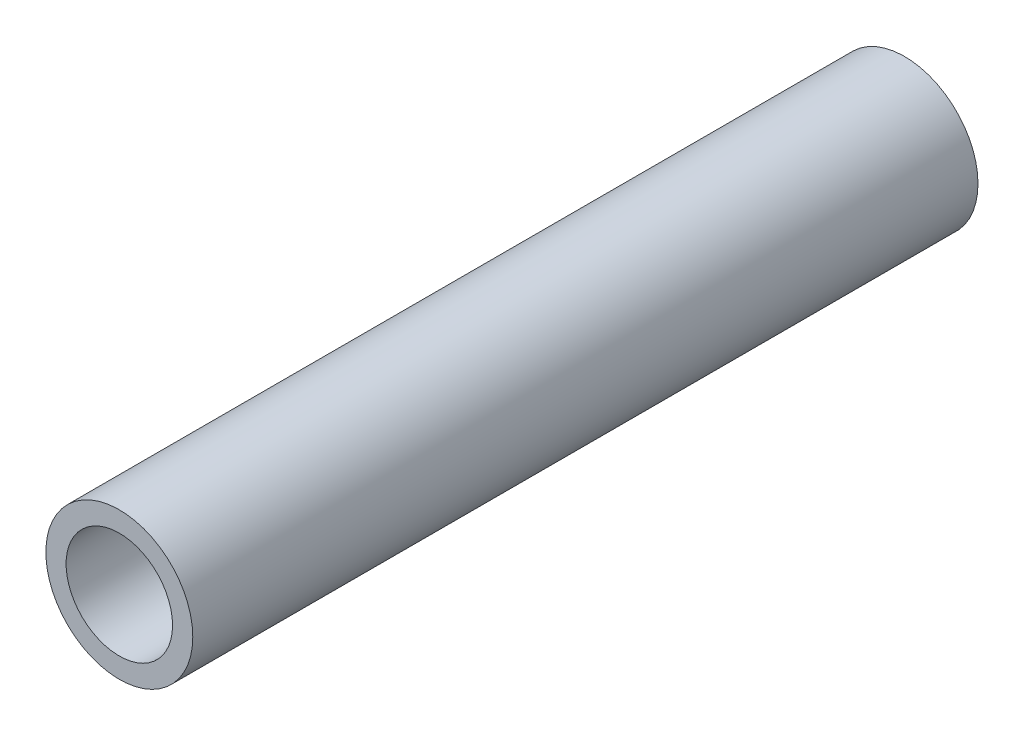
ISO-10303-21;
HEADER;
FILE_DESCRIPTION(('STEP AP214'),'2;1');
FILE_NAME('part.step','',(''),(''),'','','');
FILE_SCHEMA(('AUTOMOTIVE_DESIGN { 1 0 10303 214 1 1 1 1 }'));
ENDSEC;
DATA;
#1=APPLICATION_CONTEXT('core data for automotive mechanical design processes');
#2=APPLICATION_PROTOCOL_DEFINITION('international standard','automotive_design',2000,#1);
#3=PRODUCT_CONTEXT('',#1,'mechanical');
#4=PRODUCT('Part','Part','',(#3));
#5=PRODUCT_RELATED_PRODUCT_CATEGORY('part','',(#4));
#6=PRODUCT_DEFINITION_FORMATION('','',#4);
#7=PRODUCT_DEFINITION_CONTEXT('part definition',#1,'design');
#8=PRODUCT_DEFINITION('design','',#6,#7);
#9=PRODUCT_DEFINITION_SHAPE('','',#8);
#10=(LENGTH_UNIT() NAMED_UNIT(*) SI_UNIT(.MILLI.,.METRE.));
#11=(NAMED_UNIT(*) PLANE_ANGLE_UNIT() SI_UNIT($,.RADIAN.));
#12=(NAMED_UNIT(*) SI_UNIT($,.STERADIAN.) SOLID_ANGLE_UNIT());
#13=UNCERTAINTY_MEASURE_WITH_UNIT(LENGTH_MEASURE(1.E-05),#10,'distance_accuracy_value','');
#14=(GEOMETRIC_REPRESENTATION_CONTEXT(3) GLOBAL_UNCERTAINTY_ASSIGNED_CONTEXT((#13)) GLOBAL_UNIT_ASSIGNED_CONTEXT((#10,
#11,#12)) REPRESENTATION_CONTEXT('',''));
#15=CARTESIAN_POINT('',(0.,0.,0.));
#16=DIRECTION('',(0.,0.,1.));
#17=DIRECTION('',(1.,0.,0.));
#18=AXIS2_PLACEMENT_3D('',#15,#16,#17);
#19=CARTESIAN_POINT('',(0.,0.,114.3));
#20=DIRECTION('',(0.,0.,1.));
#21=DIRECTION('',(1.,0.,0.));
#22=AXIS2_PLACEMENT_3D('',#19,#20,#21);
#23=PLANE('',#22);
#24=CARTESIAN_POINT('',(0.,0.,114.3));
#25=DIRECTION('',(0.,0.,1.));
#26=DIRECTION('',(1.,0.,0.));
#27=AXIS2_PLACEMENT_3D('',#24,#25,#26);
#28=CIRCLE('',#27,10.6934);
#29=CARTESIAN_POINT('',(10.6934,0.,114.3));
#30=VERTEX_POINT('',#29);
#31=EDGE_CURVE('E10',#30,#30,#28,.T.);
#32=ORIENTED_EDGE('',*,*,#31,.T.);
#33=EDGE_LOOP('',(#32));
#34=FACE_BOUND('',#33,.T.);
#35=CARTESIAN_POINT('',(0.,0.,114.3));
#36=DIRECTION('',(0.,0.,1.));
#37=DIRECTION('',(1.,0.,0.));
#38=AXIS2_PLACEMENT_3D('',#35,#36,#37);
#39=CIRCLE('',#38,7.747);
#40=CARTESIAN_POINT('',(7.747,0.,114.3));
#41=VERTEX_POINT('',#40);
#42=EDGE_CURVE('E46',#41,#41,#39,.T.);
#43=ORIENTED_EDGE('',*,*,#42,.F.);
#44=EDGE_LOOP('',(#43));
#45=FACE_BOUND('',#44,.T.);
#46=ADVANCED_FACE('F35',(#34,#45),#23,.T.);
#47=CARTESIAN_POINT('',(0.,0.,0.));
#48=DIRECTION('',(0.,0.,1.));
#49=DIRECTION('',(1.,0.,0.));
#50=AXIS2_PLACEMENT_3D('',#47,#48,#49);
#51=PLANE('',#50);
#52=CARTESIAN_POINT('',(0.,0.,0.));
#53=DIRECTION('',(0.,0.,1.));
#54=DIRECTION('',(1.,0.,0.));
#55=AXIS2_PLACEMENT_3D('',#52,#53,#54);
#56=CIRCLE('',#55,10.6934);
#57=CARTESIAN_POINT('',(10.6934,0.,0.));
#58=VERTEX_POINT('',#57);
#59=EDGE_CURVE('E39',#58,#58,#56,.T.);
#60=ORIENTED_EDGE('',*,*,#59,.F.);
#61=EDGE_LOOP('',(#60));
#62=FACE_BOUND('',#61,.T.);
#63=CARTESIAN_POINT('',(0.,0.,0.));
#64=DIRECTION('',(0.,0.,1.));
#65=DIRECTION('',(1.,0.,0.));
#66=AXIS2_PLACEMENT_3D('',#63,#64,#65);
#67=CIRCLE('',#66,7.747);
#68=CARTESIAN_POINT('',(7.747,0.,0.));
#69=VERTEX_POINT('',#68);
#70=EDGE_CURVE('E48',#69,#69,#67,.T.);
#71=ORIENTED_EDGE('',*,*,#70,.T.);
#72=EDGE_LOOP('',(#71));
#73=FACE_BOUND('',#72,.T.);
#74=ADVANCED_FACE('F58',(#62,#73),#51,.F.);
#75=CARTESIAN_POINT('',(0.,0.,114.3));
#76=DIRECTION('',(0.,0.,-1.));
#77=DIRECTION('',(-1.,0.,0.));
#78=AXIS2_PLACEMENT_3D('',#75,#76,#77);
#79=CYLINDRICAL_SURFACE('',#78,10.6934);
#80=ORIENTED_EDGE('',*,*,#31,.F.);
#81=EDGE_LOOP('',(#80));
#82=FACE_BOUND('',#81,.T.);
#83=ORIENTED_EDGE('',*,*,#59,.T.);
#84=EDGE_LOOP('',(#83));
#85=FACE_BOUND('',#84,.T.);
#86=ADVANCED_FACE('F37',(#82,#85),#79,.T.);
#87=CARTESIAN_POINT('',(0.,0.,114.3));
#88=DIRECTION('',(0.,0.,-1.));
#89=DIRECTION('',(-1.,0.,0.));
#90=AXIS2_PLACEMENT_3D('',#87,#88,#89);
#91=CYLINDRICAL_SURFACE('',#90,7.747);
#92=ORIENTED_EDGE('',*,*,#42,.T.);
#93=EDGE_LOOP('',(#92));
#94=FACE_BOUND('',#93,.T.);
#95=ORIENTED_EDGE('',*,*,#70,.F.);
#96=EDGE_LOOP('',(#95));
#97=FACE_BOUND('',#96,.T.);
#98=ADVANCED_FACE('F54',(#94,#97),#91,.F.);
#99=CLOSED_SHELL('',(#46,#74,#86,#98));
#100=MANIFOLD_SOLID_BREP('B2',#99);
#101=ADVANCED_BREP_SHAPE_REPRESENTATION('',(#18,#100),#14);
#102=SHAPE_DEFINITION_REPRESENTATION(#9,#101);
ENDSEC;
END-ISO-10303-21;
